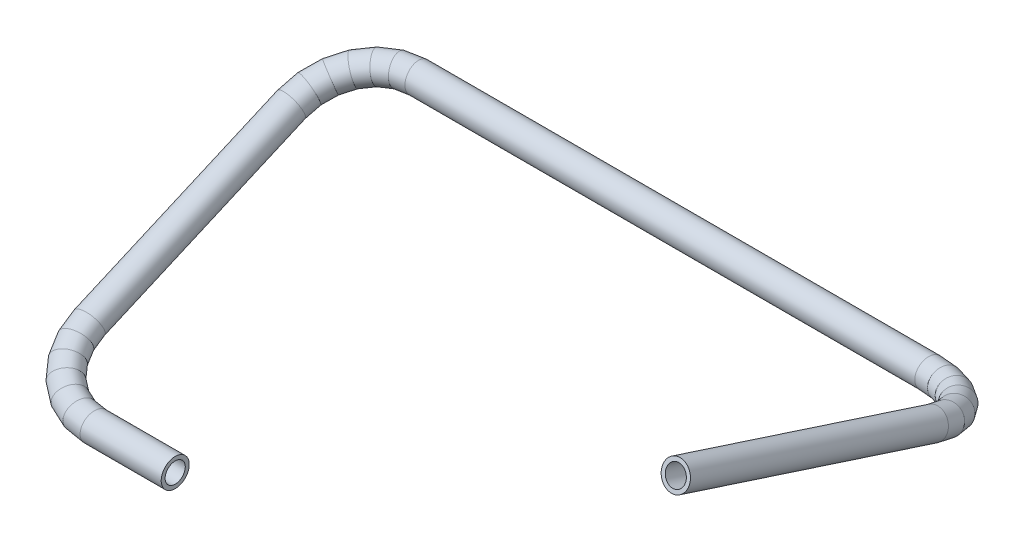
ISO-10303-21;
HEADER;
FILE_DESCRIPTION(('STEP AP214'),'2;1');
FILE_NAME('part.step','',(''),(''),'','','');
FILE_SCHEMA(('AUTOMOTIVE_DESIGN { 1 0 10303 214 1 1 1 1 }'));
ENDSEC;
DATA;
#1=APPLICATION_CONTEXT('core data for automotive mechanical design processes');
#2=APPLICATION_PROTOCOL_DEFINITION('international standard','automotive_design',2000,#1);
#3=PRODUCT_CONTEXT('',#1,'mechanical');
#4=PRODUCT('Part','Part','',(#3));
#5=PRODUCT_RELATED_PRODUCT_CATEGORY('part','',(#4));
#6=PRODUCT_DEFINITION_FORMATION('','',#4);
#7=PRODUCT_DEFINITION_CONTEXT('part definition',#1,'design');
#8=PRODUCT_DEFINITION('design','',#6,#7);
#9=PRODUCT_DEFINITION_SHAPE('','',#8);
#10=(LENGTH_UNIT() NAMED_UNIT(*) SI_UNIT(.MILLI.,.METRE.));
#11=(NAMED_UNIT(*) PLANE_ANGLE_UNIT() SI_UNIT($,.RADIAN.));
#12=(NAMED_UNIT(*) SI_UNIT($,.STERADIAN.) SOLID_ANGLE_UNIT());
#13=UNCERTAINTY_MEASURE_WITH_UNIT(LENGTH_MEASURE(1.E-05),#10,'distance_accuracy_value','');
#14=(GEOMETRIC_REPRESENTATION_CONTEXT(3) GLOBAL_UNCERTAINTY_ASSIGNED_CONTEXT((#13)) GLOBAL_UNIT_ASSIGNED_CONTEXT((#10,
#11,#12)) REPRESENTATION_CONTEXT('',''));
#15=CARTESIAN_POINT('',(0.,0.,0.));
#16=DIRECTION('',(0.,0.,1.));
#17=DIRECTION('',(1.,0.,0.));
#18=AXIS2_PLACEMENT_3D('',#15,#16,#17);
#19=CARTESIAN_POINT('',(-2780.09277838077,-22.5582405893711,-69.4271256895462));
#20=DIRECTION('',(0.,0.309016994374948,0.951056516295154));
#21=DIRECTION('',(0.,-0.951056516295154,0.309016994374948));
#22=AXIS2_PLACEMENT_3D('',#19,#20,#21);
#23=CYLINDRICAL_SURFACE('',#22,3.175);
#24=CARTESIAN_POINT('',(-2780.09277838077,-22.5582405893711,-69.4271256895462));
#25=DIRECTION('',(0.0654031292301251,0.308355365269415,0.949020231289341));
#26=DIRECTION('',(0.997858923238605,-0.0202106784174095,-0.0622020722404045));
#27=AXIS2_PLACEMENT_3D('',#24,#25,#26);
#28=ELLIPSE('',#27,3.18181250481317,3.175);
#29=CARTESIAN_POINT('',(-2776.91777838077,-22.6225471786904,-69.625041020826));
#30=VERTEX_POINT('',#29);
#31=EDGE_CURVE('E77',#30,#30,#28,.F.);
#32=ORIENTED_EDGE('',*,*,#31,.F.);
#33=EDGE_LOOP('',(#32));
#34=FACE_BOUND('',#33,.T.);
#35=CARTESIAN_POINT('',(-2780.09277838077,-3.61549883418684,-11.1273612406533));
#36=DIRECTION('',(0.,0.309016994374948,0.951056516295154));
#37=DIRECTION('',(0.,-0.951056516295154,0.309016994374948));
#38=AXIS2_PLACEMENT_3D('',#35,#36,#37);
#39=CIRCLE('',#38,3.175);
#40=CARTESIAN_POINT('',(-2780.09277838077,-6.63510327342395,-10.1462322835129));
#41=VERTEX_POINT('',#40);
#42=EDGE_CURVE('E11',#41,#41,#39,.T.);
#43=ORIENTED_EDGE('',*,*,#42,.F.);
#44=EDGE_LOOP('',(#43));
#45=FACE_BOUND('',#44,.T.);
#46=ADVANCED_FACE('F58',(#34,#45),#23,.T.);
#47=CARTESIAN_POINT('',(-2780.09277838077,-22.5582405893711,-69.4271256895462));
#48=DIRECTION('',(0.,0.309016994374948,0.951056516295154));
#49=DIRECTION('',(0.,-0.951056516295154,0.309016994374948));
#50=AXIS2_PLACEMENT_3D('',#47,#48,#49);
#51=CYLINDRICAL_SURFACE('',#50,2.286);
#52=CARTESIAN_POINT('',(-2780.09277838077,-22.5582405893711,-69.4271256895462));
#53=DIRECTION('',(0.0654031292301251,0.308355365269415,0.949020231289341));
#54=DIRECTION('',(0.997858923238605,-0.0202106784174095,-0.0622020722404045));
#55=AXIS2_PLACEMENT_3D('',#52,#53,#54);
#56=ELLIPSE('',#55,2.29090500346548,2.286);
#57=CARTESIAN_POINT('',(-2777.80677838077,-22.604541333681,-69.5696247280677));
#58=VERTEX_POINT('',#57);
#59=EDGE_CURVE('E75',#58,#58,#56,.F.);
#60=ORIENTED_EDGE('',*,*,#59,.T.);
#61=EDGE_LOOP('',(#60));
#62=FACE_BOUND('',#61,.T.);
#63=CARTESIAN_POINT('',(-2780.09277838077,-3.61549883418684,-11.1273612406533));
#64=DIRECTION('',(0.,0.309016994374948,0.951056516295154));
#65=DIRECTION('',(0.,-0.951056516295154,0.309016994374948));
#66=AXIS2_PLACEMENT_3D('',#63,#64,#65);
#67=CIRCLE('',#66,2.286);
#68=CARTESIAN_POINT('',(-2780.09277838077,-5.78961403043756,-10.4209483915122));
#69=VERTEX_POINT('',#68);
#70=EDGE_CURVE('E61',#69,#69,#67,.T.);
#71=ORIENTED_EDGE('',*,*,#70,.T.);
#72=EDGE_LOOP('',(#71));
#73=FACE_BOUND('',#72,.T.);
#74=ADVANCED_FACE('F65',(#62,#73),#51,.F.);
#75=CARTESIAN_POINT('',(-2780.60389098644,-23.7579328404397,-73.1193987803368));
#76=DIRECTION('',(0.130526192220016,0.306373311150223,0.942920095956912));
#77=DIRECTION('',(0.,-0.951056516295154,0.309016994374948));
#78=AXIS2_PLACEMENT_3D('',#75,#76,#77);
#79=CYLINDRICAL_SURFACE('',#78,2.286);
#80=CARTESIAN_POINT('',(-2780.60389098644,-23.7579328404397,-73.1193987803368));
#81=DIRECTION('',(0.258819045102501,0.298487495628987,0.918650051350004));
#82=DIRECTION('',(0.965925826289074,-0.0799794834045674,-0.246151539386024));
#83=AXIS2_PLACEMENT_3D('',#80,#81,#82);
#84=ELLIPSE('',#83,2.30572580388623,2.286);
#85=CARTESIAN_POINT('',(-2778.37673088412,-23.9423435991071,-73.6869567363655));
#86=VERTEX_POINT('',#85);
#87=EDGE_CURVE('E78',#86,#86,#84,.T.);
#88=ORIENTED_EDGE('',*,*,#87,.F.);
#89=EDGE_LOOP('',(#88));
#90=FACE_BOUND('',#89,.T.);
#91=ORIENTED_EDGE('',*,*,#59,.F.);
#92=EDGE_LOOP('',(#91));
#93=FACE_BOUND('',#92,.T.);
#94=ADVANCED_FACE('F215',(#90,#93),#79,.F.);
#95=CARTESIAN_POINT('',(-2780.60389098644,-23.7579328404397,-73.1193987803368));
#96=DIRECTION('',(0.130526192220016,0.306373311150223,0.942920095956912));
#97=DIRECTION('',(0.,-0.951056516295154,0.309016994374948));
#98=AXIS2_PLACEMENT_3D('',#95,#96,#97);
#99=CYLINDRICAL_SURFACE('',#98,3.175);
#100=CARTESIAN_POINT('',(-2780.60389098644,-23.7579328404397,-73.1193987803368));
#101=DIRECTION('',(0.258819045102501,0.298487495628987,0.918650051350004));
#102=DIRECTION('',(0.965925826289074,-0.0799794834045674,-0.246151539386024));
#103=AXIS2_PLACEMENT_3D('',#100,#101,#102);
#104=ELLIPSE('',#103,3.20239694984199,3.175);
#105=CARTESIAN_POINT('',(-2777.51061306656,-24.0140588941445,-73.9076737192655));
#106=VERTEX_POINT('',#105);
#107=EDGE_CURVE('E80',#106,#106,#104,.T.);
#108=ORIENTED_EDGE('',*,*,#107,.T.);
#109=EDGE_LOOP('',(#108));
#110=FACE_BOUND('',#109,.T.);
#111=ORIENTED_EDGE('',*,*,#31,.T.);
#112=EDGE_LOOP('',(#111));
#113=FACE_BOUND('',#112,.T.);
#114=ADVANCED_FACE('F202',(#110,#113),#99,.T.);
#115=CARTESIAN_POINT('',(-2782.10239732401,-24.8758680471832,-76.5600495617598));
#116=DIRECTION('',(0.382683432365086,0.28549447630117,0.878661649666581));
#117=DIRECTION('',(0.916819345772575,0.,-0.399302250453399));
#118=AXIS2_PLACEMENT_3D('',#115,#116,#117);
#119=CYLINDRICAL_SURFACE('',#118,3.175);
#120=CARTESIAN_POINT('',(-2782.10239732401,-24.8758680471832,-76.5600495617598));
#121=DIRECTION('',(0.50000000000001,0.267616567329816,0.823639103546326));
#122=DIRECTION('',(0.866025403784433,-0.154508497187475,-0.475528258147587));
#123=AXIS2_PLACEMENT_3D('',#120,#121,#122);
#124=ELLIPSE('',#123,3.20239694984199,3.175);
#125=CARTESIAN_POINT('',(-2779.32904021244,-25.3706655873011,-78.0828798052153));
#126=VERTEX_POINT('',#125);
#127=EDGE_CURVE('E81',#126,#126,#124,.F.);
#128=ORIENTED_EDGE('',*,*,#127,.F.);
#129=EDGE_LOOP('',(#128));
#130=FACE_BOUND('',#129,.T.);
#131=ORIENTED_EDGE('',*,*,#107,.F.);
#132=EDGE_LOOP('',(#131));
#133=FACE_BOUND('',#132,.T.);
#134=ADVANCED_FACE('F220',(#130,#133),#119,.T.);
#135=CARTESIAN_POINT('',(-2782.10239732401,-24.8758680471832,-76.5600495617598));
#136=DIRECTION('',(0.382683432365086,0.28549447630117,0.878661649666581));
#137=DIRECTION('',(0.916819345772575,0.,-0.399302250453399));
#138=AXIS2_PLACEMENT_3D('',#135,#136,#137);
#139=CYLINDRICAL_SURFACE('',#138,2.286);
#140=CARTESIAN_POINT('',(-2782.10239732401,-24.8758680471832,-76.5600495617598));
#141=DIRECTION('',(0.50000000000001,0.267616567329816,0.823639103546326));
#142=DIRECTION('',(0.866025403784433,-0.154508497187475,-0.475528258147587));
#143=AXIS2_PLACEMENT_3D('',#140,#141,#142);
#144=ELLIPSE('',#143,2.30572580388623,2.286);
#145=CARTESIAN_POINT('',(-2780.10558020368,-25.2321222760681,-77.6564873370478));
#146=VERTEX_POINT('',#145);
#147=EDGE_CURVE('E82',#146,#146,#144,.F.);
#148=ORIENTED_EDGE('',*,*,#147,.T.);
#149=EDGE_LOOP('',(#148));
#150=FACE_BOUND('',#149,.T.);
#151=ORIENTED_EDGE('',*,*,#87,.T.);
#152=EDGE_LOOP('',(#151));
#153=FACE_BOUND('',#152,.T.);
#154=ADVANCED_FACE('F225',(#150,#153),#139,.F.);
#155=CARTESIAN_POINT('',(-2784.48617666298,-25.8358607727373,-79.5146033690056));
#156=DIRECTION('',(0.608761429008742,0.245159664694118,0.75452386400849));
#157=DIRECTION('',(0.778274692967016,0.,-0.627923962185787));
#158=AXIS2_PLACEMENT_3D('',#155,#156,#157);
#159=CYLINDRICAL_SURFACE('',#158,2.286);
#160=CARTESIAN_POINT('',(-2784.48617666298,-25.8358607727373,-79.5146033690056));
#161=DIRECTION('',(0.707106781186549,0.21850801222441,0.672498511963955));
#162=DIRECTION('',(0.707106781186546,-0.218508012224417,-0.672498511963957));
#163=AXIS2_PLACEMENT_3D('',#160,#161,#162);
#164=ELLIPSE('',#163,2.30572580388622,2.286);
#165=CARTESIAN_POINT('',(-2782.85578231149,-26.339680334879,-81.065200541116));
#166=VERTEX_POINT('',#165);
#167=EDGE_CURVE('E86',#166,#166,#164,.T.);
#168=ORIENTED_EDGE('',*,*,#167,.F.);
#169=EDGE_LOOP('',(#168));
#170=FACE_BOUND('',#169,.T.);
#171=ORIENTED_EDGE('',*,*,#147,.F.);
#172=EDGE_LOOP('',(#171));
#173=FACE_BOUND('',#172,.T.);
#174=ADVANCED_FACE('F223',(#170,#173),#159,.F.);
#175=CARTESIAN_POINT('',(-2784.48617666298,-25.8358607727373,-79.5146033690056));
#176=DIRECTION('',(0.608761429008742,0.245159664694118,0.75452386400849));
#177=DIRECTION('',(0.778274692967016,0.,-0.627923962185787));
#178=AXIS2_PLACEMENT_3D('',#175,#176,#177);
#179=CYLINDRICAL_SURFACE('',#178,3.175);
#180=CARTESIAN_POINT('',(-2784.48617666298,-25.8358607727373,-79.5146033690056));
#181=DIRECTION('',(0.707106781186549,0.21850801222441,0.672498511963955));
#182=DIRECTION('',(0.707106781186546,-0.218508012224417,-0.672498511963957));
#183=AXIS2_PLACEMENT_3D('',#180,#181,#182);
#184=ELLIPSE('',#183,3.20239694984197,3.175);
#185=CARTESIAN_POINT('',(-2782.22174006369,-26.5356101646008,-81.6682105524923));
#186=VERTEX_POINT('',#185);
#187=EDGE_CURVE('E83',#186,#186,#184,.T.);
#188=ORIENTED_EDGE('',*,*,#187,.T.);
#189=EDGE_LOOP('',(#188));
#190=FACE_BOUND('',#189,.T.);
#191=ORIENTED_EDGE('',*,*,#127,.T.);
#192=EDGE_LOOP('',(#191));
#193=FACE_BOUND('',#192,.T.);
#194=ADVANCED_FACE('F228',(#190,#193),#179,.T.);
#195=CARTESIAN_POINT('',(-2787.59277838077,-26.5724890993184,-81.7817122427412));
#196=DIRECTION('',(0.793353340291222,0.188117627083678,0.57896652392791));
#197=DIRECTION('',(0.589490998187474,0.,-0.807774945796127));
#198=AXIS2_PLACEMENT_3D('',#195,#196,#197);
#199=CYLINDRICAL_SURFACE('',#198,3.175);
#200=CARTESIAN_POINT('',(-2787.59277838077,-26.5724890993184,-81.7817122427412));
#201=DIRECTION('',(0.866025403784437,0.154508497187474,0.475528258147579));
#202=DIRECTION('',(0.500000000000002,-0.267616567329818,-0.823639103546331));
#203=AXIS2_PLACEMENT_3D('',#200,#201,#202);
#204=ELLIPSE('',#203,3.20239694984199,3.175);
#205=CARTESIAN_POINT('',(-2785.99157990585,-27.4295035782626,-84.4193315957086));
#206=VERTEX_POINT('',#205);
#207=EDGE_CURVE('E95',#206,#206,#204,.F.);
#208=ORIENTED_EDGE('',*,*,#207,.F.);
#209=EDGE_LOOP('',(#208));
#210=FACE_BOUND('',#209,.T.);
#211=ORIENTED_EDGE('',*,*,#187,.F.);
#212=EDGE_LOOP('',(#211));
#213=FACE_BOUND('',#212,.T.);
#214=ADVANCED_FACE('F235',(#210,#213),#199,.T.);
#215=CARTESIAN_POINT('',(-2787.59277838077,-26.5724890993184,-81.7817122427412));
#216=DIRECTION('',(0.793353340291222,0.188117627083678,0.57896652392791));
#217=DIRECTION('',(0.589490998187474,0.,-0.807774945796127));
#218=AXIS2_PLACEMENT_3D('',#215,#216,#217);
#219=CYLINDRICAL_SURFACE('',#218,2.286);
#220=CARTESIAN_POINT('',(-2787.59277838077,-26.5724890993184,-81.7817122427412));
#221=DIRECTION('',(0.866025403784437,0.154508497187474,0.475528258147579));
#222=DIRECTION('',(0.500000000000002,-0.267616567329818,-0.823639103546331));
#223=AXIS2_PLACEMENT_3D('',#220,#221,#222);
#224=ELLIPSE('',#223,2.30572580388624,2.286);
#225=CARTESIAN_POINT('',(-2786.43991547883,-27.1895395241582,-83.6807981768777));
#226=VERTEX_POINT('',#225);
#227=EDGE_CURVE('E90',#226,#226,#224,.F.);
#228=ORIENTED_EDGE('',*,*,#227,.T.);
#229=EDGE_LOOP('',(#228));
#230=FACE_BOUND('',#229,.T.);
#231=ORIENTED_EDGE('',*,*,#167,.T.);
#232=EDGE_LOOP('',(#231));
#233=FACE_BOUND('',#232,.T.);
#234=ADVANCED_FACE('F236',(#230,#233),#219,.F.);
#235=CARTESIAN_POINT('',(-2791.21049270424,-27.0355530238059,-83.2068764597962));
#236=DIRECTION('',(0.923879532511293,0.118255684066543,0.363953572028999));
#237=DIRECTION('',(0.366525415369671,0.,-0.930408039458006));
#238=AXIS2_PLACEMENT_3D('',#235,#236,#237);
#239=CYLINDRICAL_SURFACE('',#238,2.286);
#240=CARTESIAN_POINT('',(-2791.21049270424,-27.0355530238059,-83.2068764597962));
#241=DIRECTION('',(0.965925826289071,0.0799794834045716,0.246151539386031));
#242=DIRECTION('',(0.25881904510251,-0.298487495628982,-0.918650051350003));
#243=AXIS2_PLACEMENT_3D('',#240,#241,#242);
#244=ELLIPSE('',#243,2.30572580388623,2.286);
#245=CARTESIAN_POINT('',(-2790.61372695341,-27.723783344615,-85.3250315879353));
#246=VERTEX_POINT('',#245);
#247=EDGE_CURVE('E96',#246,#246,#244,.T.);
#248=ORIENTED_EDGE('',*,*,#247,.F.);
#249=EDGE_LOOP('',(#248));
#250=FACE_BOUND('',#249,.T.);
#251=ORIENTED_EDGE('',*,*,#227,.F.);
#252=EDGE_LOOP('',(#251));
#253=FACE_BOUND('',#252,.T.);
#254=ADVANCED_FACE('F242',(#250,#253),#239,.F.);
#255=CARTESIAN_POINT('',(-2791.21049270424,-27.0355530238059,-83.2068764597962));
#256=DIRECTION('',(0.923879532511293,0.118255684066543,0.363953572028999));
#257=DIRECTION('',(0.366525415369671,0.,-0.930408039458006));
#258=AXIS2_PLACEMENT_3D('',#255,#256,#257);
#259=CYLINDRICAL_SURFACE('',#258,3.175);
#260=CARTESIAN_POINT('',(-2791.21049270424,-27.0355530238059,-83.2068764597962));
#261=DIRECTION('',(0.965925826289071,0.0799794834045716,0.246151539386031));
#262=DIRECTION('',(0.25881904510251,-0.298487495628982,-0.918650051350003));
#263=AXIS2_PLACEMENT_3D('',#260,#261,#262);
#264=ELLIPSE('',#263,3.20239694984198,3.175);
#265=CARTESIAN_POINT('',(-2790.38165138364,-27.9914284693741,-86.1487585822117));
#266=VERTEX_POINT('',#265);
#267=EDGE_CURVE('E91',#266,#266,#264,.T.);
#268=ORIENTED_EDGE('',*,*,#267,.T.);
#269=EDGE_LOOP('',(#268));
#270=FACE_BOUND('',#269,.T.);
#271=ORIENTED_EDGE('',*,*,#207,.T.);
#272=EDGE_LOOP('',(#271));
#273=FACE_BOUND('',#272,.T.);
#274=ADVANCED_FACE('F247',(#270,#273),#259,.T.);
#275=CARTESIAN_POINT('',(-2795.09277838077,-27.1934955049954,-83.6929734339735));
#276=DIRECTION('',(0.991444861373811,0.0403348116070459,0.124137785658069));
#277=DIRECTION('',(0.124238888735265,0.,-0.992252336115076));
#278=AXIS2_PLACEMENT_3D('',#275,#276,#277);
#279=CYLINDRICAL_SURFACE('',#278,3.175);
#280=CARTESIAN_POINT('',(-2795.09277838077,-27.1934955049954,-83.6929734339735));
#281=DIRECTION('',(0.997858923238604,0.0202106784174145,0.0622020722404191));
#282=DIRECTION('',(0.0654031292301406,-0.308355365269418,-0.949020231289338));
#283=AXIS2_PLACEMENT_3D('',#280,#281,#282);
#284=ELLIPSE('',#283,3.18181250481317,3.175);
#285=CARTESIAN_POINT('',(-2794.88467788634,-28.1746244621358,-86.7125778732107));
#286=VERTEX_POINT('',#285);
#287=EDGE_CURVE('E99',#286,#286,#284,.F.);
#288=ORIENTED_EDGE('',*,*,#287,.F.);
#289=EDGE_LOOP('',(#288));
#290=FACE_BOUND('',#289,.T.);
#291=ORIENTED_EDGE('',*,*,#267,.F.);
#292=EDGE_LOOP('',(#291));
#293=FACE_BOUND('',#292,.T.);
#294=ADVANCED_FACE('F246',(#290,#293),#279,.T.);
#295=CARTESIAN_POINT('',(-2795.09277838077,-27.1934955049954,-83.6929734339735));
#296=DIRECTION('',(0.991444861373811,0.0403348116070459,0.124137785658069));
#297=DIRECTION('',(0.124238888735265,0.,-0.992252336115076));
#298=AXIS2_PLACEMENT_3D('',#295,#296,#297);
#299=CYLINDRICAL_SURFACE('',#298,2.286);
#300=CARTESIAN_POINT('',(-2795.09277838077,-27.1934955049954,-83.6929734339735));
#301=DIRECTION('',(0.997858923238604,0.0202106784174145,0.0622020722404191));
#302=DIRECTION('',(0.0654031292301406,-0.308355365269418,-0.949020231289338));
#303=AXIS2_PLACEMENT_3D('',#300,#301,#302);
#304=ELLIPSE('',#303,2.29090500346549,2.286);
#305=CARTESIAN_POINT('',(-2794.94294602478,-27.8999083541365,-85.8670886302243));
#306=VERTEX_POINT('',#305);
#307=EDGE_CURVE('E100',#306,#306,#304,.F.);
#308=ORIENTED_EDGE('',*,*,#307,.T.);
#309=EDGE_LOOP('',(#308));
#310=FACE_BOUND('',#309,.T.);
#311=ORIENTED_EDGE('',*,*,#247,.T.);
#312=EDGE_LOOP('',(#311));
#313=FACE_BOUND('',#312,.T.);
#314=ADVANCED_FACE('F255',(#310,#313),#299,.F.);
#315=CARTESIAN_POINT('',(-2911.09277838077,-27.1934955049954,-83.6929734339735));
#316=DIRECTION('',(1.,0.,0.));
#317=DIRECTION('',(0.,0.,-1.));
#318=AXIS2_PLACEMENT_3D('',#315,#316,#317);
#319=CYLINDRICAL_SURFACE('',#318,2.286);
#320=CARTESIAN_POINT('',(-2911.09277838077,-27.1934955049954,-83.6929734339735));
#321=DIRECTION('',(0.997858923238604,0.0261031748900516,-0.0599682713920765));
#322=DIRECTION('',(-0.0654031292301397,0.398257488525373,-0.914939016284893));
#323=AXIS2_PLACEMENT_3D('',#320,#321,#322);
#324=ELLIPSE('',#323,2.29090500346549,2.286);
#325=CARTESIAN_POINT('',(-2911.24261073677,-26.281125431865,-85.7890118042464));
#326=VERTEX_POINT('',#325);
#327=EDGE_CURVE('E102',#326,#326,#324,.T.);
#328=ORIENTED_EDGE('',*,*,#327,.F.);
#329=EDGE_LOOP('',(#328));
#330=FACE_BOUND('',#329,.T.);
#331=ORIENTED_EDGE('',*,*,#307,.F.);
#332=EDGE_LOOP('',(#331));
#333=FACE_BOUND('',#332,.T.);
#334=ADVANCED_FACE('F260',(#330,#333),#319,.F.);
#335=CARTESIAN_POINT('',(-2911.09277838077,-27.1934955049954,-83.6929734339735));
#336=DIRECTION('',(1.,0.,0.));
#337=DIRECTION('',(0.,0.,-1.));
#338=AXIS2_PLACEMENT_3D('',#335,#336,#337);
#339=CYLINDRICAL_SURFACE('',#338,3.175);
#340=CARTESIAN_POINT('',(-2911.09277838077,-27.1934955049954,-83.6929734339735));
#341=DIRECTION('',(0.997858923238604,0.0261031748900516,-0.0599682713920765));
#342=DIRECTION('',(-0.0654031292301397,0.398257488525373,-0.914939016284893));
#343=AXIS2_PLACEMENT_3D('',#340,#341,#342);
#344=ELLIPSE('',#343,3.18181250481317,3.175);
#345=CARTESIAN_POINT('',(-2911.30087887521,-25.9263148478698,-86.6041378371303));
#346=VERTEX_POINT('',#345);
#347=EDGE_CURVE('E101',#346,#346,#344,.T.);
#348=ORIENTED_EDGE('',*,*,#347,.T.);
#349=EDGE_LOOP('',(#348));
#350=FACE_BOUND('',#349,.T.);
#351=ORIENTED_EDGE('',*,*,#287,.T.);
#352=EDGE_LOOP('',(#351));
#353=FACE_BOUND('',#352,.T.);
#354=ADVANCED_FACE('F265',(#350,#353),#339,.T.);
#355=CARTESIAN_POINT('',(-2914.97506405731,-27.3974866884632,-83.2243331745677));
#356=DIRECTION('',(0.991444861373811,0.0520945719777917,-0.119679749439556));
#357=DIRECTION('',(-0.119842476837868,0.,-0.992792919367058));
#358=AXIS2_PLACEMENT_3D('',#355,#356,#357);
#359=CYLINDRICAL_SURFACE('',#358,3.175);
#360=CARTESIAN_POINT('',(-2914.97506405731,-27.3974866884632,-83.2243331745677));
#361=DIRECTION('',(0.965925826289071,0.103297791385697,-0.237311745184709));
#362=DIRECTION('',(-0.25881904510251,0.385512605761075,-0.885659490262218));
#363=AXIS2_PLACEMENT_3D('',#360,#361,#362);
#364=ELLIPSE('',#363,3.20239694984198,3.175);
#365=CARTESIAN_POINT('',(-2915.80390537791,-26.1629222956483,-86.060566424782));
#366=VERTEX_POINT('',#365);
#367=EDGE_CURVE('E107',#366,#366,#364,.F.);
#368=ORIENTED_EDGE('',*,*,#367,.F.);
#369=EDGE_LOOP('',(#368));
#370=FACE_BOUND('',#369,.T.);
#371=ORIENTED_EDGE('',*,*,#347,.F.);
#372=EDGE_LOOP('',(#371));
#373=FACE_BOUND('',#372,.T.);
#374=ADVANCED_FACE('F264',(#370,#373),#359,.T.);
#375=CARTESIAN_POINT('',(-2914.97506405731,-27.3974866884632,-83.2243331745677));
#376=DIRECTION('',(0.991444861373811,0.0520945719777917,-0.119679749439556));
#377=DIRECTION('',(-0.119842476837868,0.,-0.992792919367058));
#378=AXIS2_PLACEMENT_3D('',#375,#376,#377);
#379=CYLINDRICAL_SURFACE('',#378,2.286);
#380=CARTESIAN_POINT('',(-2914.97506405731,-27.3974866884632,-83.2243331745677));
#381=DIRECTION('',(0.965925826289071,0.103297791385697,-0.237311745184709));
#382=DIRECTION('',(-0.25881904510251,0.385512605761075,-0.885659490262218));
#383=AXIS2_PLACEMENT_3D('',#380,#381,#382);
#384=ELLIPSE('',#383,2.30572580388623,2.286);
#385=CARTESIAN_POINT('',(-2915.57182980814,-26.5086003256365,-85.266421114722));
#386=VERTEX_POINT('',#385);
#387=EDGE_CURVE('E104',#386,#386,#384,.F.);
#388=ORIENTED_EDGE('',*,*,#387,.T.);
#389=EDGE_LOOP('',(#388));
#390=FACE_BOUND('',#389,.T.);
#391=ORIENTED_EDGE('',*,*,#327,.T.);
#392=EDGE_LOOP('',(#391));
#393=FACE_BOUND('',#392,.T.);
#394=ADVANCED_FACE('F269',(#390,#393),#379,.F.);
#395=CARTESIAN_POINT('',(-2918.59277838077,-27.9955585768248,-81.8503494555639));
#396=DIRECTION('',(0.923879532511292,0.152733556943435,-0.350883271174507));
#397=DIRECTION('',(-0.355048916896833,0.,-0.934847723755257));
#398=AXIS2_PLACEMENT_3D('',#395,#396,#397);
#399=CYLINDRICAL_SURFACE('',#398,2.286);
#400=CARTESIAN_POINT('',(-2918.59277838077,-27.9955585768248,-81.8503494555639));
#401=DIRECTION('',(0.866025403784438,0.199556008996138,-0.458451087111302));
#402=DIRECTION('',(-0.500000000000001,0.345641146536994,-0.794060575661952));
#403=AXIS2_PLACEMENT_3D('',#400,#401,#402);
#404=ELLIPSE('',#403,2.30572580388623,2.286);
#405=CARTESIAN_POINT('',(-2919.74564128272,-27.1986048663696,-83.6812354147164));
#406=VERTEX_POINT('',#405);
#407=EDGE_CURVE('E115',#406,#406,#404,.T.);
#408=ORIENTED_EDGE('',*,*,#407,.F.);
#409=EDGE_LOOP('',(#408));
#410=FACE_BOUND('',#409,.T.);
#411=ORIENTED_EDGE('',*,*,#387,.F.);
#412=EDGE_LOOP('',(#411));
#413=FACE_BOUND('',#412,.T.);
#414=ADVANCED_FACE('F272',(#410,#413),#399,.F.);
#415=CARTESIAN_POINT('',(-2918.59277838077,-27.9955585768248,-81.8503494555639));
#416=DIRECTION('',(0.923879532511292,0.152733556943435,-0.350883271174507));
#417=DIRECTION('',(-0.355048916896833,0.,-0.934847723755257));
#418=AXIS2_PLACEMENT_3D('',#415,#416,#417);
#419=CYLINDRICAL_SURFACE('',#418,3.175);
#420=CARTESIAN_POINT('',(-2918.59277838077,-27.9955585768248,-81.8503494555639));
#421=DIRECTION('',(0.866025403784438,0.199556008996138,-0.458451087111302));
#422=DIRECTION('',(-0.500000000000001,0.345641146536994,-0.794060575661952));
#423=AXIS2_PLACEMENT_3D('',#420,#421,#422);
#424=ELLIPSE('',#423,3.20239694984199,3.175);
#425=CARTESIAN_POINT('',(-2920.1939768557,-26.8886784234148,-84.3932466210535));
#426=VERTEX_POINT('',#425);
#427=EDGE_CURVE('E108',#426,#426,#424,.T.);
#428=ORIENTED_EDGE('',*,*,#427,.T.);
#429=EDGE_LOOP('',(#428));
#430=FACE_BOUND('',#429,.T.);
#431=ORIENTED_EDGE('',*,*,#367,.T.);
#432=EDGE_LOOP('',(#431));
#433=FACE_BOUND('',#432,.T.);
#434=ADVANCED_FACE('F279',(#430,#433),#419,.T.);
#435=CARTESIAN_POINT('',(-2921.69938009857,-28.9469535592487,-79.6646569967969));
#436=DIRECTION('',(0.793353340291224,0.242964002407539,-0.558174677840966));
#437=DIRECTION('',(-0.575416868633113,0.,-0.817860273697447));
#438=AXIS2_PLACEMENT_3D('',#435,#436,#437);
#439=CYLINDRICAL_SURFACE('',#438,3.175);
#440=CARTESIAN_POINT('',(-2921.69938009857,-28.9469535592487,-79.6646569967969));
#441=DIRECTION('',(0.70710678118655,0.282214814375385,-0.648347745077488));
#442=DIRECTION('',(-0.707106781186545,0.282214814375378,-0.648347745077497));
#443=AXIS2_PLACEMENT_3D('',#440,#441,#442);
#444=ELLIPSE('',#443,3.20239694984197,3.175);
#445=CARTESIAN_POINT('',(-2923.96381669786,-28.0431896984928,-81.74092383807));
#446=VERTEX_POINT('',#445);
#447=EDGE_CURVE('E117',#446,#446,#444,.F.);
#448=ORIENTED_EDGE('',*,*,#447,.F.);
#449=EDGE_LOOP('',(#448));
#450=FACE_BOUND('',#449,.T.);
#451=ORIENTED_EDGE('',*,*,#427,.F.);
#452=EDGE_LOOP('',(#451));
#453=FACE_BOUND('',#452,.T.);
#454=ADVANCED_FACE('F282',(#450,#453),#439,.T.);
#455=CARTESIAN_POINT('',(-2921.69938009857,-28.9469535592487,-79.6646569967969));
#456=DIRECTION('',(0.793353340291224,0.242964002407539,-0.558174677840966));
#457=DIRECTION('',(-0.575416868633113,0.,-0.817860273697447));
#458=AXIS2_PLACEMENT_3D('',#455,#456,#457);
#459=CYLINDRICAL_SURFACE('',#458,2.286);
#460=CARTESIAN_POINT('',(-2921.69938009857,-28.9469535592487,-79.6646569967969));
#461=DIRECTION('',(0.70710678118655,0.282214814375385,-0.648347745077488));
#462=DIRECTION('',(-0.707106781186545,0.282214814375378,-0.648347745077497));
#463=AXIS2_PLACEMENT_3D('',#460,#461,#462);
#464=ELLIPSE('',#463,2.30572580388622,2.286);
#465=CARTESIAN_POINT('',(-2923.32977445006,-28.2962435795044,-81.1595691225135));
#466=VERTEX_POINT('',#465);
#467=EDGE_CURVE('E114',#466,#466,#464,.F.);
#468=ORIENTED_EDGE('',*,*,#467,.T.);
#469=EDGE_LOOP('',(#468));
#470=FACE_BOUND('',#469,.T.);
#471=ORIENTED_EDGE('',*,*,#407,.T.);
#472=EDGE_LOOP('',(#471));
#473=FACE_BOUND('',#472,.T.);
#474=ADVANCED_FACE('F287',(#470,#473),#459,.F.);
#475=CARTESIAN_POINT('',(-2924.08315943754,-30.1868356399375,-76.816207127304));
#476=DIRECTION('',(0.608761429008741,0.316636852624541,-0.727427402639783));
#477=DIRECTION('',(-0.766886118457599,0.,-0.641783204296464));
#478=AXIS2_PLACEMENT_3D('',#475,#476,#477);
#479=CYLINDRICAL_SURFACE('',#478,2.286);
#480=CARTESIAN_POINT('',(-2924.08315943754,-30.1868356399375,-76.816207127304));
#481=DIRECTION('',(0.500000000000009,0.34564114653698,-0.794060575661954));
#482=DIRECTION('',(-0.866025403784433,0.199556008996141,-0.458451087111309));
#483=AXIS2_PLACEMENT_3D('',#480,#481,#482);
#484=ELLIPSE('',#483,2.30572580388623,2.286);
#485=CARTESIAN_POINT('',(-2926.07997655787,-29.7267142006745,-77.8732696286762));
#486=VERTEX_POINT('',#485);
#487=EDGE_CURVE('E118',#486,#486,#484,.T.);
#488=ORIENTED_EDGE('',*,*,#487,.F.);
#489=EDGE_LOOP('',(#488));
#490=FACE_BOUND('',#489,.T.);
#491=ORIENTED_EDGE('',*,*,#467,.F.);
#492=EDGE_LOOP('',(#491));
#493=FACE_BOUND('',#492,.T.);
#494=ADVANCED_FACE('F286',(#490,#493),#479,.F.);
#495=CARTESIAN_POINT('',(-2924.08315943754,-30.1868356399375,-76.816207127304));
#496=DIRECTION('',(0.608761429008741,0.316636852624541,-0.727427402639783));
#497=DIRECTION('',(-0.766886118457599,0.,-0.641783204296464));
#498=AXIS2_PLACEMENT_3D('',#495,#496,#497);
#499=CYLINDRICAL_SURFACE('',#498,3.175);
#500=CARTESIAN_POINT('',(-2924.08315943754,-30.1868356399375,-76.816207127304));
#501=DIRECTION('',(0.500000000000009,0.34564114653698,-0.794060575661954));
#502=DIRECTION('',(-0.866025403784433,0.199556008996141,-0.458451087111309));
#503=AXIS2_PLACEMENT_3D('',#500,#501,#502);
#504=ELLIPSE('',#503,3.20239694984199,3.175);
#505=CARTESIAN_POINT('',(-2926.85651654911,-29.5477780854056,-78.284349490321));
#506=VERTEX_POINT('',#505);
#507=EDGE_CURVE('E120',#506,#506,#504,.T.);
#508=ORIENTED_EDGE('',*,*,#507,.T.);
#509=EDGE_LOOP('',(#508));
#510=FACE_BOUND('',#509,.T.);
#511=ORIENTED_EDGE('',*,*,#447,.T.);
#512=EDGE_LOOP('',(#511));
#513=FACE_BOUND('',#512,.T.);
#514=ADVANCED_FACE('F294',(#510,#513),#499,.T.);
#515=CARTESIAN_POINT('',(-2925.58166577511,-31.630708904094,-73.4991169984053));
#516=DIRECTION('',(0.382683432365086,0.36873142460234,-0.847107152079361));
#517=DIRECTION('',(-0.911322607292258,0.,-0.411692974725148));
#518=AXIS2_PLACEMENT_3D('',#515,#516,#517);
#519=CYLINDRICAL_SURFACE('',#518,3.175);
#520=CARTESIAN_POINT('',(-2925.58166577511,-31.630708904094,-73.4991169984053));
#521=DIRECTION('',(0.258819045102501,0.385512605761088,-0.885659490262214));
#522=DIRECTION('',(-0.965925826289074,0.103297791385696,-0.2373117451847));
#523=AXIS2_PLACEMENT_3D('',#520,#521,#522);
#524=ELLIPSE('',#523,3.20239694984199,3.175);
#525=CARTESIAN_POINT('',(-2928.67494369499,-31.299908372035,-74.2590834073465));
#526=VERTEX_POINT('',#525);
#527=EDGE_CURVE('E121',#526,#526,#524,.F.);
#528=ORIENTED_EDGE('',*,*,#527,.F.);
#529=EDGE_LOOP('',(#528));
#530=FACE_BOUND('',#529,.T.);
#531=ORIENTED_EDGE('',*,*,#507,.F.);
#532=EDGE_LOOP('',(#531));
#533=FACE_BOUND('',#532,.T.);
#534=ADVANCED_FACE('F300',(#530,#533),#519,.T.);
#535=CARTESIAN_POINT('',(-2925.58166577511,-31.630708904094,-73.4991169984053));
#536=DIRECTION('',(0.382683432365086,0.36873142460234,-0.847107152079361));
#537=DIRECTION('',(-0.911322607292258,0.,-0.411692974725148));
#538=AXIS2_PLACEMENT_3D('',#535,#536,#537);
#539=CYLINDRICAL_SURFACE('',#538,2.286);
#540=CARTESIAN_POINT('',(-2925.58166577511,-31.630708904094,-73.4991169984053));
#541=DIRECTION('',(0.258819045102501,0.385512605761088,-0.885659490262214));
#542=DIRECTION('',(-0.965925826289074,0.103297791385696,-0.2373117451847));
#543=AXIS2_PLACEMENT_3D('',#540,#541,#542);
#544=ELLIPSE('',#543,2.30572580388623,2.286);
#545=CARTESIAN_POINT('',(-2927.80882587743,-31.3925325210115,-74.0462928128429));
#546=VERTEX_POINT('',#545);
#547=EDGE_CURVE('E122',#546,#546,#544,.F.);
#548=ORIENTED_EDGE('',*,*,#547,.T.);
#549=EDGE_LOOP('',(#548));
#550=FACE_BOUND('',#549,.T.);
#551=ORIENTED_EDGE('',*,*,#487,.T.);
#552=EDGE_LOOP('',(#551));
#553=FACE_BOUND('',#552,.T.);
#554=ADVANCED_FACE('F304',(#550,#553),#539,.F.);
#555=CARTESIAN_POINT('',(-2926.09277838077,-33.1801757748795,-69.9394408206345));
#556=DIRECTION('',(0.130526192220016,0.395697559350975,-0.909057949015477));
#557=DIRECTION('',(0.,0.916902174222601,0.399112017992275));
#558=AXIS2_PLACEMENT_3D('',#555,#556,#557);
#559=CYLINDRICAL_SURFACE('',#558,2.286);
#560=CARTESIAN_POINT('',(-2926.09277838077,-33.1801757748795,-69.9394408206345));
#561=DIRECTION('',(0.065403129230125,0.398257488525359,-0.914939016284901));
#562=DIRECTION('',(-0.997858923238605,0.0261031748900448,-0.0599682713920634));
#563=AXIS2_PLACEMENT_3D('',#560,#561,#562);
#564=ELLIPSE('',#563,2.29090500346548,2.286);
#565=CARTESIAN_POINT('',(-2928.37877838077,-33.1203758809176,-70.0768224336157));
#566=VERTEX_POINT('',#565);
#567=EDGE_CURVE('E126',#566,#566,#564,.T.);
#568=ORIENTED_EDGE('',*,*,#567,.F.);
#569=EDGE_LOOP('',(#568));
#570=FACE_BOUND('',#569,.T.);
#571=ORIENTED_EDGE('',*,*,#547,.F.);
#572=EDGE_LOOP('',(#571));
#573=FACE_BOUND('',#572,.T.);
#574=ADVANCED_FACE('F303',(#570,#573),#559,.F.);
#575=CARTESIAN_POINT('',(-2926.09277838077,-33.1801757748795,-69.9394408206345));
#576=DIRECTION('',(0.130526192220016,0.395697559350975,-0.909057949015477));
#577=DIRECTION('',(0.,0.916902174222601,0.399112017992275));
#578=AXIS2_PLACEMENT_3D('',#575,#576,#577);
#579=CYLINDRICAL_SURFACE('',#578,3.175);
#580=CARTESIAN_POINT('',(-2926.09277838077,-33.1801757748795,-69.9394408206345));
#581=DIRECTION('',(0.065403129230125,0.398257488525359,-0.914939016284901));
#582=DIRECTION('',(-0.997858923238605,0.0261031748900448,-0.0599682713920634));
#583=AXIS2_PLACEMENT_3D('',#580,#581,#582);
#584=ELLIPSE('',#583,3.18181250481317,3.175);
#585=CARTESIAN_POINT('',(-2929.26777838077,-33.097120366599,-70.1302486164418));
#586=VERTEX_POINT('',#585);
#587=EDGE_CURVE('E123',#586,#586,#584,.T.);
#588=ORIENTED_EDGE('',*,*,#587,.T.);
#589=EDGE_LOOP('',(#588));
#590=FACE_BOUND('',#589,.T.);
#591=ORIENTED_EDGE('',*,*,#527,.T.);
#592=EDGE_LOOP('',(#591));
#593=FACE_BOUND('',#592,.T.);
#594=ADVANCED_FACE('F309',(#590,#593),#579,.T.);
#595=CARTESIAN_POINT('',(-2926.09277838077,-53.1017849108483,-24.1724232733549));
#596=DIRECTION('',(0.,0.399112017992276,-0.916902174222601));
#597=DIRECTION('',(0.,0.916902174222601,0.399112017992276));
#598=AXIS2_PLACEMENT_3D('',#595,#596,#597);
#599=CYLINDRICAL_SURFACE('',#598,3.175);
#600=CARTESIAN_POINT('',(-2926.09277838077,-53.1017849108483,-24.1724232733549));
#601=DIRECTION('',(-0.065403129230125,0.398257488525359,-0.9149390162849));
#602=DIRECTION('',(-0.997858923238605,-0.0261031748900432,0.0599682713920641));
#603=AXIS2_PLACEMENT_3D('',#600,#601,#602);
#604=ELLIPSE('',#603,3.18181250481317,3.175);
#605=CARTESIAN_POINT('',(-2929.26777838077,-53.1848403191288,-23.9816154775475));
#606=VERTEX_POINT('',#605);
#607=EDGE_CURVE('E135',#606,#606,#604,.F.);
#608=ORIENTED_EDGE('',*,*,#607,.F.);
#609=EDGE_LOOP('',(#608));
#610=FACE_BOUND('',#609,.T.);
#611=ORIENTED_EDGE('',*,*,#587,.F.);
#612=EDGE_LOOP('',(#611));
#613=FACE_BOUND('',#612,.T.);
#614=ADVANCED_FACE('F311',(#610,#613),#599,.T.);
#615=CARTESIAN_POINT('',(-2926.09277838077,-53.1017849108483,-24.1724232733549));
#616=DIRECTION('',(0.,0.399112017992276,-0.916902174222601));
#617=DIRECTION('',(0.,0.916902174222601,0.399112017992276));
#618=AXIS2_PLACEMENT_3D('',#615,#616,#617);
#619=CYLINDRICAL_SURFACE('',#618,2.286);
#620=CARTESIAN_POINT('',(-2926.09277838077,-53.1017849108483,-24.1724232733549));
#621=DIRECTION('',(-0.065403129230125,0.398257488525359,-0.9149390162849));
#622=DIRECTION('',(-0.997858923238605,-0.0261031748900432,0.0599682713920641));
#623=AXIS2_PLACEMENT_3D('',#620,#621,#622);
#624=ELLIPSE('',#623,2.29090500346548,2.286);
#625=CARTESIAN_POINT('',(-2928.37877838077,-53.1615848048103,-24.0350416603736));
#626=VERTEX_POINT('',#625);
#627=EDGE_CURVE('E129',#626,#626,#624,.F.);
#628=ORIENTED_EDGE('',*,*,#627,.T.);
#629=EDGE_LOOP('',(#628));
#630=FACE_BOUND('',#629,.T.);
#631=ORIENTED_EDGE('',*,*,#567,.T.);
#632=EDGE_LOOP('',(#631));
#633=FACE_BOUND('',#632,.T.);
#634=ADVANCED_FACE('F318',(#630,#633),#619,.F.);
#635=CARTESIAN_POINT('',(-2925.58166577511,-54.6512517816339,-20.6127470955841));
#636=DIRECTION('',(-0.130526192220016,0.395697559350976,-0.909057949015477));
#637=DIRECTION('',(0.,0.916902174222601,0.399112017992276));
#638=AXIS2_PLACEMENT_3D('',#635,#636,#637);
#639=CYLINDRICAL_SURFACE('',#638,2.286);
#640=CARTESIAN_POINT('',(-2925.58166577511,-54.6512517816339,-20.6127470955841));
#641=DIRECTION('',(-0.258819045102501,0.385512605761088,-0.885659490262214));
#642=DIRECTION('',(-0.965925826289074,-0.1032977913857,0.237311745184698));
#643=AXIS2_PLACEMENT_3D('',#640,#641,#642);
#644=ELLIPSE('',#643,2.30572580388623,2.286);
#645=CARTESIAN_POINT('',(-2927.80882587743,-54.8894281647163,-20.0655712811464));
#646=VERTEX_POINT('',#645);
#647=EDGE_CURVE('E137',#646,#646,#644,.T.);
#648=ORIENTED_EDGE('',*,*,#647,.F.);
#649=EDGE_LOOP('',(#648));
#650=FACE_BOUND('',#649,.T.);
#651=ORIENTED_EDGE('',*,*,#627,.F.);
#652=EDGE_LOOP('',(#651));
#653=FACE_BOUND('',#652,.T.);
#654=ADVANCED_FACE('F321',(#650,#653),#639,.F.);
#655=CARTESIAN_POINT('',(-2925.58166577511,-54.6512517816339,-20.6127470955841));
#656=DIRECTION('',(-0.130526192220016,0.395697559350976,-0.909057949015477));
#657=DIRECTION('',(0.,0.916902174222601,0.399112017992276));
#658=AXIS2_PLACEMENT_3D('',#655,#656,#657);
#659=CYLINDRICAL_SURFACE('',#658,3.175);
#660=CARTESIAN_POINT('',(-2925.58166577511,-54.6512517816339,-20.6127470955841));
#661=DIRECTION('',(-0.258819045102501,0.385512605761088,-0.885659490262214));
#662=DIRECTION('',(-0.965925826289074,-0.1032977913857,0.237311745184698));
#663=AXIS2_PLACEMENT_3D('',#660,#661,#662);
#664=ELLIPSE('',#663,3.20239694984199,3.175);
#665=CARTESIAN_POINT('',(-2928.67494369499,-54.9820523136928,-19.8527806866429));
#666=VERTEX_POINT('',#665);
#667=EDGE_CURVE('E134',#666,#666,#664,.T.);
#668=ORIENTED_EDGE('',*,*,#667,.T.);
#669=EDGE_LOOP('',(#668));
#670=FACE_BOUND('',#669,.T.);
#671=ORIENTED_EDGE('',*,*,#607,.T.);
#672=EDGE_LOOP('',(#671));
#673=FACE_BOUND('',#672,.T.);
#674=ADVANCED_FACE('F326',(#670,#673),#659,.T.);
#675=CARTESIAN_POINT('',(-2924.08315943754,-56.0951250457905,-17.2956569666852));
#676=DIRECTION('',(-0.382683432365086,0.368731424602339,-0.847107152079361));
#677=DIRECTION('',(-0.911322607292258,0.,0.411692974725148));
#678=AXIS2_PLACEMENT_3D('',#675,#676,#677);
#679=CYLINDRICAL_SURFACE('',#678,3.175);
#680=CARTESIAN_POINT('',(-2924.08315943754,-56.0951250457905,-17.2956569666852));
#681=DIRECTION('',(-0.500000000000009,0.34564114653698,-0.794060575661953));
#682=DIRECTION('',(-0.866025403784433,-0.199556008996132,0.458451087111313));
#683=AXIS2_PLACEMENT_3D('',#680,#681,#682);
#684=ELLIPSE('',#683,3.20239694984199,3.175);
#685=CARTESIAN_POINT('',(-2926.85651654911,-56.7341826003223,-15.8275146036682));
#686=VERTEX_POINT('',#685);
#687=EDGE_CURVE('E138',#686,#686,#684,.F.);
#688=ORIENTED_EDGE('',*,*,#687,.F.);
#689=EDGE_LOOP('',(#688));
#690=FACE_BOUND('',#689,.T.);
#691=ORIENTED_EDGE('',*,*,#667,.F.);
#692=EDGE_LOOP('',(#691));
#693=FACE_BOUND('',#692,.T.);
#694=ADVANCED_FACE('F328',(#690,#693),#679,.T.);
#695=CARTESIAN_POINT('',(-2924.08315943754,-56.0951250457905,-17.2956569666852));
#696=DIRECTION('',(-0.382683432365086,0.368731424602339,-0.847107152079361));
#697=DIRECTION('',(-0.911322607292258,0.,0.411692974725148));
#698=AXIS2_PLACEMENT_3D('',#695,#696,#697);
#699=CYLINDRICAL_SURFACE('',#698,2.286);
#700=CARTESIAN_POINT('',(-2924.08315943754,-56.0951250457905,-17.2956569666852));
#701=DIRECTION('',(-0.500000000000009,0.34564114653698,-0.794060575661953));
#702=DIRECTION('',(-0.866025403784433,-0.199556008996132,0.458451087111313));
#703=AXIS2_PLACEMENT_3D('',#700,#701,#702);
#704=ELLIPSE('',#703,2.30572580388623,2.286);
#705=CARTESIAN_POINT('',(-2926.07997655787,-56.5552464850534,-16.238594465313));
#706=VERTEX_POINT('',#705);
#707=EDGE_CURVE('E139',#706,#706,#704,.F.);
#708=ORIENTED_EDGE('',*,*,#707,.T.);
#709=EDGE_LOOP('',(#708));
#710=FACE_BOUND('',#709,.T.);
#711=ORIENTED_EDGE('',*,*,#647,.T.);
#712=EDGE_LOOP('',(#711));
#713=FACE_BOUND('',#712,.T.);
#714=ADVANCED_FACE('F331',(#710,#713),#699,.F.);
#715=CARTESIAN_POINT('',(-2921.69938009857,-57.3350071264791,-14.4472070971925));
#716=DIRECTION('',(-0.608761429008741,0.316636852624542,-0.727427402639782));
#717=DIRECTION('',(-0.766886118457598,0.,0.641783204296465));
#718=AXIS2_PLACEMENT_3D('',#715,#716,#717);
#719=CYLINDRICAL_SURFACE('',#718,2.286);
#720=CARTESIAN_POINT('',(-2921.69938009857,-57.3350071264791,-14.4472070971925));
#721=DIRECTION('',(-0.70710678118655,0.282214814375385,-0.648347745077488));
#722=DIRECTION('',(-0.707106781186545,-0.282214814375391,0.64834774507749));
#723=AXIS2_PLACEMENT_3D('',#720,#721,#722);
#724=ELLIPSE('',#723,2.30572580388622,2.286);
#725=CARTESIAN_POINT('',(-2923.32977445006,-57.9857171062234,-12.9522949714759));
#726=VERTEX_POINT('',#725);
#727=EDGE_CURVE('E145',#726,#726,#724,.T.);
#728=ORIENTED_EDGE('',*,*,#727,.F.);
#729=EDGE_LOOP('',(#728));
#730=FACE_BOUND('',#729,.T.);
#731=ORIENTED_EDGE('',*,*,#707,.F.);
#732=EDGE_LOOP('',(#731));
#733=FACE_BOUND('',#732,.T.);
#734=ADVANCED_FACE('F340',(#730,#733),#719,.F.);
#735=CARTESIAN_POINT('',(-2921.69938009857,-57.3350071264791,-14.4472070971925));
#736=DIRECTION('',(-0.608761429008741,0.316636852624542,-0.727427402639782));
#737=DIRECTION('',(-0.766886118457598,0.,0.641783204296465));
#738=AXIS2_PLACEMENT_3D('',#735,#736,#737);
#739=CYLINDRICAL_SURFACE('',#738,3.175);
#740=CARTESIAN_POINT('',(-2921.69938009857,-57.3350071264791,-14.4472070971925));
#741=DIRECTION('',(-0.70710678118655,0.282214814375385,-0.648347745077488));
#742=DIRECTION('',(-0.707106781186545,-0.282214814375391,0.64834774507749));
#743=AXIS2_PLACEMENT_3D('',#740,#741,#742);
#744=ELLIPSE('',#743,3.20239694984197,3.175);
#745=CARTESIAN_POINT('',(-2923.96381669786,-58.2387709872351,-12.3709402559194));
#746=VERTEX_POINT('',#745);
#747=EDGE_CURVE('E143',#746,#746,#744,.T.);
#748=ORIENTED_EDGE('',*,*,#747,.T.);
#749=EDGE_LOOP('',(#748));
#750=FACE_BOUND('',#749,.T.);
#751=ORIENTED_EDGE('',*,*,#687,.T.);
#752=EDGE_LOOP('',(#751));
#753=FACE_BOUND('',#752,.T.);
#754=ADVANCED_FACE('F344',(#750,#753),#739,.T.);
#755=CARTESIAN_POINT('',(-2918.59277838077,-58.2864021089031,-12.2615146384255));
#756=DIRECTION('',(-0.793353340291223,0.242964002407538,-0.558174677840968));
#757=DIRECTION('',(-0.575416868633115,0.,0.817860273697445));
#758=AXIS2_PLACEMENT_3D('',#755,#756,#757);
#759=CYLINDRICAL_SURFACE('',#758,3.175);
#760=CARTESIAN_POINT('',(-2918.59277838077,-58.2864021089031,-12.2615146384255));
#761=DIRECTION('',(-0.866025403784438,0.199556008996138,-0.458451087111302));
#762=DIRECTION('',(-0.500000000000001,-0.345641146536979,0.794060575661959));
#763=AXIS2_PLACEMENT_3D('',#760,#761,#762);
#764=ELLIPSE('',#763,3.20239694984199,3.175);
#765=CARTESIAN_POINT('',(-2920.1939768557,-59.393282262313,-9.71861747293583));
#766=VERTEX_POINT('',#765);
#767=EDGE_CURVE('E146',#766,#766,#764,.F.);
#768=ORIENTED_EDGE('',*,*,#767,.F.);
#769=EDGE_LOOP('',(#768));
#770=FACE_BOUND('',#769,.T.);
#771=ORIENTED_EDGE('',*,*,#747,.F.);
#772=EDGE_LOOP('',(#771));
#773=FACE_BOUND('',#772,.T.);
#774=ADVANCED_FACE('F343',(#770,#773),#759,.T.);
#775=CARTESIAN_POINT('',(-2918.59277838077,-58.2864021089031,-12.2615146384255));
#776=DIRECTION('',(-0.793353340291223,0.242964002407538,-0.558174677840968));
#777=DIRECTION('',(-0.575416868633115,0.,0.817860273697445));
#778=AXIS2_PLACEMENT_3D('',#775,#776,#777);
#779=CYLINDRICAL_SURFACE('',#778,2.286);
#780=CARTESIAN_POINT('',(-2918.59277838077,-58.2864021089031,-12.2615146384255));
#781=DIRECTION('',(-0.866025403784438,0.199556008996138,-0.458451087111302));
#782=DIRECTION('',(-0.500000000000001,-0.345641146536979,0.794060575661959));
#783=AXIS2_PLACEMENT_3D('',#780,#781,#782);
#784=ELLIPSE('',#783,2.30572580388623,2.286);
#785=CARTESIAN_POINT('',(-2919.74564128272,-59.0833558193582,-10.4306286792729));
#786=VERTEX_POINT('',#785);
#787=EDGE_CURVE('E144',#786,#786,#784,.F.);
#788=ORIENTED_EDGE('',*,*,#787,.T.);
#789=EDGE_LOOP('',(#788));
#790=FACE_BOUND('',#789,.T.);
#791=ORIENTED_EDGE('',*,*,#727,.T.);
#792=EDGE_LOOP('',(#791));
#793=FACE_BOUND('',#792,.T.);
#794=ADVANCED_FACE('F348',(#790,#793),#779,.F.);
#795=CARTESIAN_POINT('',(-2914.97506405731,-58.8844739972646,-10.8875309194217));
#796=DIRECTION('',(-0.923879532511293,0.152733556943436,-0.350883271174504));
#797=DIRECTION('',(-0.355048916896829,0.,0.934847723755258));
#798=AXIS2_PLACEMENT_3D('',#795,#796,#797);
#799=CYLINDRICAL_SURFACE('',#798,2.286);
#800=CARTESIAN_POINT('',(-2914.97506405731,-58.8844739972646,-10.8875309194217));
#801=DIRECTION('',(-0.965925826289071,0.103297791385697,-0.23731174518471));
#802=DIRECTION('',(-0.258819045102511,-0.38551260576109,0.88565949026221));
#803=AXIS2_PLACEMENT_3D('',#800,#801,#802);
#804=ELLIPSE('',#803,2.30572580388623,2.286);
#805=CARTESIAN_POINT('',(-2915.57182980814,-59.7733603600914,-8.84544297926741));
#806=VERTEX_POINT('',#805);
#807=EDGE_CURVE('E155',#806,#806,#804,.T.);
#808=ORIENTED_EDGE('',*,*,#807,.F.);
#809=EDGE_LOOP('',(#808));
#810=FACE_BOUND('',#809,.T.);
#811=ORIENTED_EDGE('',*,*,#787,.F.);
#812=EDGE_LOOP('',(#811));
#813=FACE_BOUND('',#812,.T.);
#814=ADVANCED_FACE('F354',(#810,#813),#799,.F.);
#815=CARTESIAN_POINT('',(-2914.97506405731,-58.8844739972646,-10.8875309194217));
#816=DIRECTION('',(-0.923879532511293,0.152733556943436,-0.350883271174504));
#817=DIRECTION('',(-0.355048916896829,0.,0.934847723755258));
#818=AXIS2_PLACEMENT_3D('',#815,#816,#817);
#819=CYLINDRICAL_SURFACE('',#818,3.175);
#820=CARTESIAN_POINT('',(-2914.97506405731,-58.8844739972646,-10.8875309194217));
#821=DIRECTION('',(-0.965925826289071,0.103297791385697,-0.23731174518471));
#822=DIRECTION('',(-0.258819045102511,-0.38551260576109,0.88565949026221));
#823=AXIS2_PLACEMENT_3D('',#820,#821,#822);
#824=ELLIPSE('',#823,3.20239694984198,3.175);
#825=CARTESIAN_POINT('',(-2915.80390537791,-60.1190383900796,-8.0512976692074));
#826=VERTEX_POINT('',#825);
#827=EDGE_CURVE('E149',#826,#826,#824,.T.);
#828=ORIENTED_EDGE('',*,*,#827,.T.);
#829=EDGE_LOOP('',(#828));
#830=FACE_BOUND('',#829,.T.);
#831=ORIENTED_EDGE('',*,*,#767,.T.);
#832=EDGE_LOOP('',(#831));
#833=FACE_BOUND('',#832,.T.);
#834=ADVANCED_FACE('F360',(#830,#833),#819,.T.);
#835=CARTESIAN_POINT('',(-2911.09277838077,-59.0884651807325,-10.4188906600158));
#836=DIRECTION('',(-0.991444861373811,0.0520945719777908,-0.11967974943956));
#837=DIRECTION('',(-0.119842476837872,0.,0.992792919367057));
#838=AXIS2_PLACEMENT_3D('',#835,#836,#837);
#839=CYLINDRICAL_SURFACE('',#838,3.175);
#840=CARTESIAN_POINT('',(-2911.09277838077,-59.0884651807325,-10.4188906600158));
#841=DIRECTION('',(-0.997858923238604,0.0261031748900512,-0.0599682713920784));
#842=DIRECTION('',(0.0654031292301413,0.398257488525356,-0.9149390162849));
#843=AXIS2_PLACEMENT_3D('',#840,#841,#842);
#844=ELLIPSE('',#843,3.18181250481317,3.175);
#845=CARTESIAN_POINT('',(-2910.88467788634,-57.821284523607,-13.3300550631726));
#846=VERTEX_POINT('',#845);
#847=EDGE_CURVE('E156',#846,#846,#844,.F.);
#848=ORIENTED_EDGE('',*,*,#847,.F.);
#849=EDGE_LOOP('',(#848));
#850=FACE_BOUND('',#849,.T.);
#851=ORIENTED_EDGE('',*,*,#827,.F.);
#852=EDGE_LOOP('',(#851));
#853=FACE_BOUND('',#852,.T.);
#854=ADVANCED_FACE('F363',(#850,#853),#839,.T.);
#855=CARTESIAN_POINT('',(-2911.09277838077,-59.0884651807325,-10.4188906600158));
#856=DIRECTION('',(-0.991444861373811,0.0520945719777908,-0.11967974943956));
#857=DIRECTION('',(-0.119842476837872,0.,0.992792919367057));
#858=AXIS2_PLACEMENT_3D('',#855,#856,#857);
#859=CYLINDRICAL_SURFACE('',#858,2.286);
#860=CARTESIAN_POINT('',(-2911.09277838077,-59.0884651807325,-10.4188906600158));
#861=DIRECTION('',(-0.997858923238604,0.0261031748900512,-0.0599682713920784));
#862=DIRECTION('',(0.0654031292301413,0.398257488525356,-0.9149390162849));
#863=AXIS2_PLACEMENT_3D('',#860,#861,#862);
#864=ELLIPSE('',#863,2.29090500346549,2.286);
#865=CARTESIAN_POINT('',(-2910.94294602478,-58.1760951076021,-12.5149290302887));
#866=VERTEX_POINT('',#865);
#867=EDGE_CURVE('E153',#866,#866,#864,.F.);
#868=ORIENTED_EDGE('',*,*,#867,.T.);
#869=EDGE_LOOP('',(#868));
#870=FACE_BOUND('',#869,.T.);
#871=ORIENTED_EDGE('',*,*,#807,.T.);
#872=EDGE_LOOP('',(#871));
#873=FACE_BOUND('',#872,.T.);
#874=ADVANCED_FACE('F368',(#870,#873),#859,.F.);
#875=CARTESIAN_POINT('',(-2920.07303450184,-59.0884651807325,-10.4188906600158));
#876=DIRECTION('',(1.,0.,0.));
#877=DIRECTION('',(0.,0.,-1.));
#878=AXIS2_PLACEMENT_3D('',#875,#876,#877);
#879=CYLINDRICAL_SURFACE('',#878,2.286);
#880=CARTESIAN_POINT('',(-2892.89277838077,-59.0884651807325,-10.4188906600158));
#881=DIRECTION('',(1.,0.,0.));
#882=DIRECTION('',(0.,0.,-1.));
#883=AXIS2_PLACEMENT_3D('',#880,#881,#882);
#884=CIRCLE('',#883,2.286);
#885=CARTESIAN_POINT('',(-2892.89277838077,-59.0884651807325,-12.7048906600158));
#886=VERTEX_POINT('',#885);
#887=EDGE_CURVE('E160',#886,#886,#884,.T.);
#888=ORIENTED_EDGE('',*,*,#887,.T.);
#889=EDGE_LOOP('',(#888));
#890=FACE_BOUND('',#889,.T.);
#891=ORIENTED_EDGE('',*,*,#867,.F.);
#892=EDGE_LOOP('',(#891));
#893=FACE_BOUND('',#892,.T.);
#894=ADVANCED_FACE('F369',(#890,#893),#879,.F.);
#895=CARTESIAN_POINT('',(-2892.89277838077,-59.0884651807325,-10.4188906600158));
#896=DIRECTION('',(1.,0.,0.));
#897=DIRECTION('',(0.,0.,-1.));
#898=AXIS2_PLACEMENT_3D('',#895,#896,#897);
#899=PLANE('',#898);
#900=ORIENTED_EDGE('',*,*,#887,.F.);
#901=EDGE_LOOP('',(#900));
#902=FACE_BOUND('',#901,.T.);
#903=CARTESIAN_POINT('',(-2892.89277838077,-59.0884651807325,-10.4188906600158));
#904=DIRECTION('',(1.,0.,0.));
#905=DIRECTION('',(0.,0.,-1.));
#906=AXIS2_PLACEMENT_3D('',#903,#904,#905);
#907=CIRCLE('',#906,3.175);
#908=CARTESIAN_POINT('',(-2892.89277838077,-59.0884651807325,-13.5938906600158));
#909=VERTEX_POINT('',#908);
#910=EDGE_CURVE('E159',#909,#909,#907,.T.);
#911=ORIENTED_EDGE('',*,*,#910,.T.);
#912=EDGE_LOOP('',(#911));
#913=FACE_BOUND('',#912,.T.);
#914=ADVANCED_FACE('F376',(#902,#913),#899,.T.);
#915=CARTESIAN_POINT('',(-2920.07303450184,-59.0884651807325,-10.4188906600158));
#916=DIRECTION('',(1.,0.,0.));
#917=DIRECTION('',(0.,0.,-1.));
#918=AXIS2_PLACEMENT_3D('',#915,#916,#917);
#919=CYLINDRICAL_SURFACE('',#918,3.175);
#920=ORIENTED_EDGE('',*,*,#910,.F.);
#921=EDGE_LOOP('',(#920));
#922=FACE_BOUND('',#921,.T.);
#923=ORIENTED_EDGE('',*,*,#847,.T.);
#924=EDGE_LOOP('',(#923));
#925=FACE_BOUND('',#924,.T.);
#926=ADVANCED_FACE('F378',(#922,#925),#919,.T.);
#927=CARTESIAN_POINT('',(-2780.09277838077,-3.61549883418684,-11.1273612406533));
#928=DIRECTION('',(0.,0.309016994374948,0.951056516295154));
#929=DIRECTION('',(0.,-0.951056516295154,0.309016994374948));
#930=AXIS2_PLACEMENT_3D('',#927,#928,#929);
#931=PLANE('',#930);
#932=ORIENTED_EDGE('',*,*,#70,.F.);
#933=EDGE_LOOP('',(#932));
#934=FACE_BOUND('',#933,.T.);
#935=ORIENTED_EDGE('',*,*,#42,.T.);
#936=EDGE_LOOP('',(#935));
#937=FACE_BOUND('',#936,.T.);
#938=ADVANCED_FACE('F381',(#934,#937),#931,.T.);
#939=CLOSED_SHELL('',(#46,#74,#94,#114,#134,#154,#174,#194,#214,#234,#254,#274,#294,#314,#334,
#354,#374,#394,#414,#434,#454,#474,#494,#514,#534,#554,#574,#594,#614,#634,#654,#674,#694,#714,
#734,#754,#774,#794,#814,#834,#854,#874,#894,#914,#926,#938));
#940=MANIFOLD_SOLID_BREP('B2',#939);
#941=ADVANCED_BREP_SHAPE_REPRESENTATION('',(#18,#940),#14);
#942=SHAPE_DEFINITION_REPRESENTATION(#9,#941);
ENDSEC;
END-ISO-10303-21;
